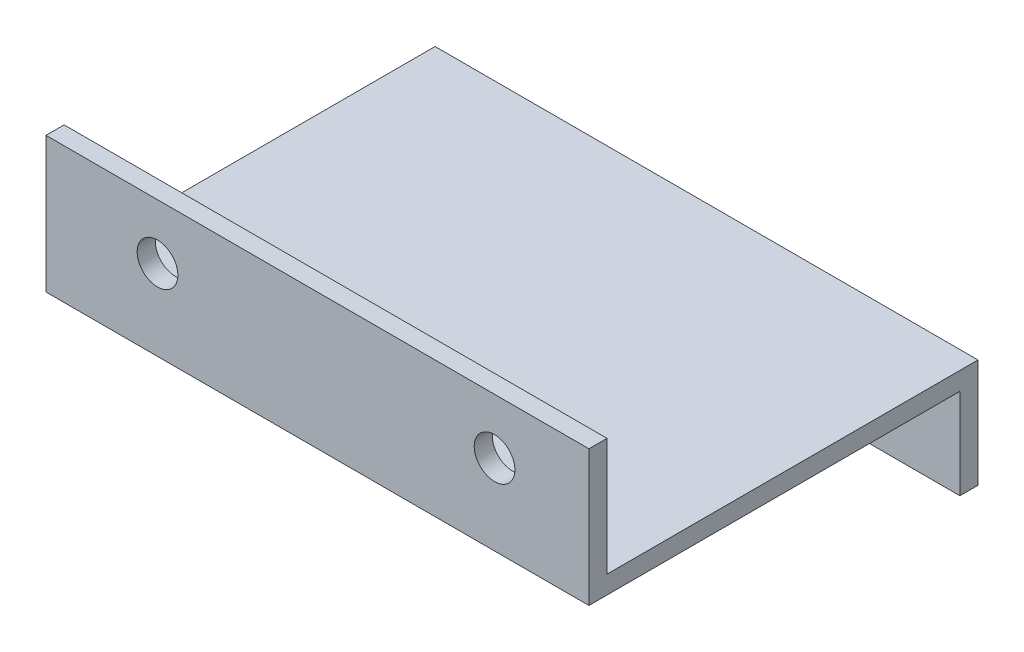
ISO-10303-21;
HEADER;
FILE_DESCRIPTION(('STEP AP214'),'2;1');
FILE_NAME('part.step','',(''),(''),'','','');
FILE_SCHEMA(('AUTOMOTIVE_DESIGN { 1 0 10303 214 1 1 1 1 }'));
ENDSEC;
DATA;
#1=APPLICATION_CONTEXT('core data for automotive mechanical design processes');
#2=APPLICATION_PROTOCOL_DEFINITION('international standard','automotive_design',2000,#1);
#3=PRODUCT_CONTEXT('',#1,'mechanical');
#4=PRODUCT('Part','Part','',(#3));
#5=PRODUCT_RELATED_PRODUCT_CATEGORY('part','',(#4));
#6=PRODUCT_DEFINITION_FORMATION('','',#4);
#7=PRODUCT_DEFINITION_CONTEXT('part definition',#1,'design');
#8=PRODUCT_DEFINITION('design','',#6,#7);
#9=PRODUCT_DEFINITION_SHAPE('','',#8);
#10=(LENGTH_UNIT() NAMED_UNIT(*) SI_UNIT(.MILLI.,.METRE.));
#11=(NAMED_UNIT(*) PLANE_ANGLE_UNIT() SI_UNIT($,.RADIAN.));
#12=(NAMED_UNIT(*) SI_UNIT($,.STERADIAN.) SOLID_ANGLE_UNIT());
#13=UNCERTAINTY_MEASURE_WITH_UNIT(LENGTH_MEASURE(1.E-05),#10,'distance_accuracy_value','');
#14=(GEOMETRIC_REPRESENTATION_CONTEXT(3) GLOBAL_UNCERTAINTY_ASSIGNED_CONTEXT((#13)) GLOBAL_UNIT_ASSIGNED_CONTEXT((#10,
#11,#12)) REPRESENTATION_CONTEXT('',''));
#15=CARTESIAN_POINT('',(0.,0.,0.));
#16=DIRECTION('',(0.,0.,1.));
#17=DIRECTION('',(1.,0.,0.));
#18=AXIS2_PLACEMENT_3D('',#15,#16,#17);
#19=CARTESIAN_POINT('',(-30.,-10.,43.));
#20=DIRECTION('',(0.,1.,0.));
#21=DIRECTION('',(0.,0.,1.));
#22=AXIS2_PLACEMENT_3D('',#19,#20,#21);
#23=PLANE('',#22);
#24=DIRECTION('',(1.,0.,0.));
#25=VECTOR('',#24,1.);
#26=CARTESIAN_POINT('',(30.,-10.,1.99999999999999));
#27=LINE('',#26,#25);
#28=CARTESIAN_POINT('',(-30.,-10.,1.99999999999999));
#29=VERTEX_POINT('',#28);
#30=CARTESIAN_POINT('',(30.,-10.,1.99999999999999));
#31=VERTEX_POINT('',#30);
#32=EDGE_CURVE('E140',#29,#31,#27,.T.);
#33=ORIENTED_EDGE('',*,*,#32,.F.);
#34=DIRECTION('',(0.,0.,-1.));
#35=VECTOR('',#34,1.);
#36=CARTESIAN_POINT('',(-30.,-10.,43.));
#37=LINE('',#36,#35);
#38=CARTESIAN_POINT('',(-30.,-10.,0.));
#39=VERTEX_POINT('',#38);
#40=EDGE_CURVE('E11',#29,#39,#37,.T.);
#41=ORIENTED_EDGE('',*,*,#40,.T.);
#42=DIRECTION('',(1.,0.,0.));
#43=VECTOR('',#42,1.);
#44=CARTESIAN_POINT('',(-30.,-10.,0.));
#45=LINE('',#44,#43);
#46=CARTESIAN_POINT('',(30.,-10.,0.));
#47=VERTEX_POINT('',#46);
#48=EDGE_CURVE('E158',#39,#47,#45,.T.);
#49=ORIENTED_EDGE('',*,*,#48,.T.);
#50=DIRECTION('',(0.,0.,-1.));
#51=VECTOR('',#50,1.);
#52=CARTESIAN_POINT('',(30.,-10.,43.));
#53=LINE('',#52,#51);
#54=EDGE_CURVE('E41',#31,#47,#53,.T.);
#55=ORIENTED_EDGE('',*,*,#54,.F.);
#56=EDGE_LOOP('',(#33,#41,#49,#55));
#57=FACE_BOUND('',#56,.T.);
#58=ADVANCED_FACE('F33',(#57),#23,.F.);
#59=CARTESIAN_POINT('',(30.,-10.,43.));
#60=DIRECTION('',(-1.,0.,0.));
#61=DIRECTION('',(0.,0.,1.));
#62=AXIS2_PLACEMENT_3D('',#59,#60,#61);
#63=PLANE('',#62);
#64=DIRECTION('',(0.,1.,0.));
#65=VECTOR('',#64,1.);
#66=CARTESIAN_POINT('',(30.,-10.,43.));
#67=LINE('',#66,#65);
#68=CARTESIAN_POINT('',(30.,0.,43.));
#69=VERTEX_POINT('',#68);
#70=CARTESIAN_POINT('',(30.,15.,43.));
#71=VERTEX_POINT('',#70);
#72=EDGE_CURVE('E155',#69,#71,#67,.T.);
#73=ORIENTED_EDGE('',*,*,#72,.F.);
#74=DIRECTION('',(0.,0.,1.));
#75=VECTOR('',#74,1.);
#76=CARTESIAN_POINT('',(30.,0.,1.99999999999999));
#77=LINE('',#76,#75);
#78=CARTESIAN_POINT('',(30.,0.,1.99999999999999));
#79=VERTEX_POINT('',#78);
#80=EDGE_CURVE('E48',#79,#69,#77,.T.);
#81=ORIENTED_EDGE('',*,*,#80,.F.);
#82=DIRECTION('',(0.,1.,0.));
#83=VECTOR('',#82,1.);
#84=CARTESIAN_POINT('',(30.,-10.,1.99999999999999));
#85=LINE('',#84,#83);
#86=EDGE_CURVE('E132',#31,#79,#85,.T.);
#87=ORIENTED_EDGE('',*,*,#86,.F.);
#88=ORIENTED_EDGE('',*,*,#54,.T.);
#89=DIRECTION('',(0.,1.,0.));
#90=VECTOR('',#89,1.);
#91=CARTESIAN_POINT('',(30.,-10.,0.));
#92=LINE('',#91,#90);
#93=CARTESIAN_POINT('',(30.,2.,0.));
#94=VERTEX_POINT('',#93);
#95=EDGE_CURVE('E153',#47,#94,#92,.T.);
#96=ORIENTED_EDGE('',*,*,#95,.T.);
#97=DIRECTION('',(0.,0.,-1.));
#98=VECTOR('',#97,1.);
#99=CARTESIAN_POINT('',(30.,2.,41.));
#100=LINE('',#99,#98);
#101=CARTESIAN_POINT('',(30.,2.,41.));
#102=VERTEX_POINT('',#101);
#103=EDGE_CURVE('E56',#102,#94,#100,.T.);
#104=ORIENTED_EDGE('',*,*,#103,.F.);
#105=DIRECTION('',(0.,-1.,0.));
#106=VECTOR('',#105,1.);
#107=CARTESIAN_POINT('',(30.,10.,41.));
#108=LINE('',#107,#106);
#109=CARTESIAN_POINT('',(30.,15.,41.));
#110=VERTEX_POINT('',#109);
#111=EDGE_CURVE('E97',#110,#102,#108,.T.);
#112=ORIENTED_EDGE('',*,*,#111,.F.);
#113=DIRECTION('',(0.,0.,-1.));
#114=VECTOR('',#113,1.);
#115=CARTESIAN_POINT('',(30.,15.,43.));
#116=LINE('',#115,#114);
#117=EDGE_CURVE('E101',#71,#110,#116,.T.);
#118=ORIENTED_EDGE('',*,*,#117,.F.);
#119=EDGE_LOOP('',(#73,#81,#87,#88,#96,#104,#112,#118));
#120=FACE_BOUND('',#119,.T.);
#121=ADVANCED_FACE('F35',(#120),#63,.F.);
#122=CARTESIAN_POINT('',(-30.,-10.,43.));
#123=DIRECTION('',(1.,0.,0.));
#124=DIRECTION('',(0.,0.,-1.));
#125=AXIS2_PLACEMENT_3D('',#122,#123,#124);
#126=PLANE('',#125);
#127=DIRECTION('',(0.,-1.,0.));
#128=VECTOR('',#127,1.);
#129=CARTESIAN_POINT('',(-30.,-10.,1.99999999999999));
#130=LINE('',#129,#128);
#131=CARTESIAN_POINT('',(-30.,0.,1.99999999999999));
#132=VERTEX_POINT('',#131);
#133=EDGE_CURVE('E138',#132,#29,#130,.T.);
#134=ORIENTED_EDGE('',*,*,#133,.F.);
#135=DIRECTION('',(0.,0.,1.));
#136=VECTOR('',#135,1.);
#137=CARTESIAN_POINT('',(-30.,0.,1.99999999999999));
#138=LINE('',#137,#136);
#139=CARTESIAN_POINT('',(-30.,0.,43.));
#140=VERTEX_POINT('',#139);
#141=EDGE_CURVE('E143',#132,#140,#138,.T.);
#142=ORIENTED_EDGE('',*,*,#141,.T.);
#143=DIRECTION('',(0.,-1.,0.));
#144=VECTOR('',#143,1.);
#145=CARTESIAN_POINT('',(-30.,-10.,43.));
#146=LINE('',#145,#144);
#147=CARTESIAN_POINT('',(-30.,15.,43.));
#148=VERTEX_POINT('',#147);
#149=EDGE_CURVE('E157',#148,#140,#146,.T.);
#150=ORIENTED_EDGE('',*,*,#149,.F.);
#151=DIRECTION('',(0.,0.,1.));
#152=VECTOR('',#151,1.);
#153=CARTESIAN_POINT('',(-30.,15.,41.));
#154=LINE('',#153,#152);
#155=CARTESIAN_POINT('',(-30.,15.,41.));
#156=VERTEX_POINT('',#155);
#157=EDGE_CURVE('E116',#156,#148,#154,.T.);
#158=ORIENTED_EDGE('',*,*,#157,.F.);
#159=DIRECTION('',(0.,1.,0.));
#160=VECTOR('',#159,1.);
#161=CARTESIAN_POINT('',(-30.,10.,41.));
#162=LINE('',#161,#160);
#163=CARTESIAN_POINT('',(-30.,2.,41.));
#164=VERTEX_POINT('',#163);
#165=EDGE_CURVE('E112',#164,#156,#162,.T.);
#166=ORIENTED_EDGE('',*,*,#165,.F.);
#167=DIRECTION('',(0.,0.,-1.));
#168=VECTOR('',#167,1.);
#169=CARTESIAN_POINT('',(-30.,2.,41.));
#170=LINE('',#169,#168);
#171=CARTESIAN_POINT('',(-30.,2.,0.));
#172=VERTEX_POINT('',#171);
#173=EDGE_CURVE('E150',#164,#172,#170,.T.);
#174=ORIENTED_EDGE('',*,*,#173,.T.);
#175=DIRECTION('',(0.,-1.,0.));
#176=VECTOR('',#175,1.);
#177=CARTESIAN_POINT('',(-30.,-10.,0.));
#178=LINE('',#177,#176);
#179=EDGE_CURVE('E162',#172,#39,#178,.T.);
#180=ORIENTED_EDGE('',*,*,#179,.T.);
#181=ORIENTED_EDGE('',*,*,#40,.F.);
#182=EDGE_LOOP('',(#134,#142,#150,#158,#166,#174,#180,#181));
#183=FACE_BOUND('',#182,.T.);
#184=ADVANCED_FACE('F179',(#183),#126,.F.);
#185=CARTESIAN_POINT('',(0.,0.,43.));
#186=DIRECTION('',(0.,0.,-1.));
#187=DIRECTION('',(-1.,0.,0.));
#188=AXIS2_PLACEMENT_3D('',#185,#186,#187);
#189=PLANE('',#188);
#190=CARTESIAN_POINT('',(19.5711604288178,8.89368921249556,43.));
#191=DIRECTION('',(0.,0.,-1.));
#192=DIRECTION('',(-1.,0.,0.));
#193=AXIS2_PLACEMENT_3D('',#190,#191,#192);
#194=CIRCLE('',#193,2.25);
#195=CARTESIAN_POINT('',(17.3211604288178,8.89368921249556,43.));
#196=VERTEX_POINT('',#195);
#197=EDGE_CURVE('E227',#196,#196,#194,.T.);
#198=ORIENTED_EDGE('',*,*,#197,.T.);
#199=EDGE_LOOP('',(#198));
#200=FACE_BOUND('',#199,.T.);
#201=CARTESIAN_POINT('',(-17.6761757128006,8.89368921249556,43.));
#202=DIRECTION('',(0.,0.,-1.));
#203=DIRECTION('',(-1.,0.,0.));
#204=AXIS2_PLACEMENT_3D('',#201,#202,#203);
#205=CIRCLE('',#204,2.25);
#206=CARTESIAN_POINT('',(-19.9261757128006,8.89368921249556,43.));
#207=VERTEX_POINT('',#206);
#208=EDGE_CURVE('E122',#207,#207,#205,.T.);
#209=ORIENTED_EDGE('',*,*,#208,.T.);
#210=EDGE_LOOP('',(#209));
#211=FACE_BOUND('',#210,.T.);
#212=ORIENTED_EDGE('',*,*,#149,.T.);
#213=DIRECTION('',(-1.,0.,0.));
#214=VECTOR('',#213,1.);
#215=CARTESIAN_POINT('',(30.,0.,43.));
#216=LINE('',#215,#214);
#217=EDGE_CURVE('E131',#69,#140,#216,.T.);
#218=ORIENTED_EDGE('',*,*,#217,.F.);
#219=ORIENTED_EDGE('',*,*,#72,.T.);
#220=DIRECTION('',(1.,0.,0.));
#221=VECTOR('',#220,1.);
#222=CARTESIAN_POINT('',(-30.,15.,43.));
#223=LINE('',#222,#221);
#224=EDGE_CURVE('E121',#148,#71,#223,.T.);
#225=ORIENTED_EDGE('',*,*,#224,.F.);
#226=EDGE_LOOP('',(#212,#218,#219,#225));
#227=FACE_BOUND('',#226,.T.);
#228=ADVANCED_FACE('F181',(#200,#211,#227),#189,.F.);
#229=CARTESIAN_POINT('',(0.,0.,0.));
#230=DIRECTION('',(0.,0.,-1.));
#231=DIRECTION('',(-1.,0.,0.));
#232=AXIS2_PLACEMENT_3D('',#229,#230,#231);
#233=PLANE('',#232);
#234=DIRECTION('',(-1.,0.,0.));
#235=VECTOR('',#234,1.);
#236=CARTESIAN_POINT('',(30.,2.,0.));
#237=LINE('',#236,#235);
#238=EDGE_CURVE('E106',#94,#172,#237,.T.);
#239=ORIENTED_EDGE('',*,*,#238,.F.);
#240=ORIENTED_EDGE('',*,*,#95,.F.);
#241=ORIENTED_EDGE('',*,*,#48,.F.);
#242=ORIENTED_EDGE('',*,*,#179,.F.);
#243=EDGE_LOOP('',(#239,#240,#241,#242));
#244=FACE_BOUND('',#243,.T.);
#245=ADVANCED_FACE('F175',(#244),#233,.T.);
#246=CARTESIAN_POINT('',(30.,2.,41.));
#247=DIRECTION('',(0.,-1.,0.));
#248=DIRECTION('',(0.,0.,-1.));
#249=AXIS2_PLACEMENT_3D('',#246,#247,#248);
#250=PLANE('',#249);
#251=ORIENTED_EDGE('',*,*,#238,.T.);
#252=ORIENTED_EDGE('',*,*,#173,.F.);
#253=DIRECTION('',(-1.,0.,0.));
#254=VECTOR('',#253,1.);
#255=CARTESIAN_POINT('',(30.,2.,41.));
#256=LINE('',#255,#254);
#257=EDGE_CURVE('E105',#102,#164,#256,.T.);
#258=ORIENTED_EDGE('',*,*,#257,.F.);
#259=ORIENTED_EDGE('',*,*,#103,.T.);
#260=EDGE_LOOP('',(#251,#252,#258,#259));
#261=FACE_BOUND('',#260,.T.);
#262=ADVANCED_FACE('F176',(#261),#250,.F.);
#263=CARTESIAN_POINT('',(0.,0.,41.));
#264=DIRECTION('',(0.,0.,-1.));
#265=DIRECTION('',(-1.,0.,0.));
#266=AXIS2_PLACEMENT_3D('',#263,#264,#265);
#267=PLANE('',#266);
#268=CARTESIAN_POINT('',(19.5711604288178,8.89368921249556,41.));
#269=DIRECTION('',(0.,0.,-1.));
#270=DIRECTION('',(-1.,0.,0.));
#271=AXIS2_PLACEMENT_3D('',#268,#269,#270);
#272=CIRCLE('',#271,2.25);
#273=CARTESIAN_POINT('',(17.3211604288178,8.89368921249556,41.));
#274=VERTEX_POINT('',#273);
#275=EDGE_CURVE('E223',#274,#274,#272,.T.);
#276=ORIENTED_EDGE('',*,*,#275,.F.);
#277=EDGE_LOOP('',(#276));
#278=FACE_BOUND('',#277,.T.);
#279=CARTESIAN_POINT('',(-17.6761757128006,8.89368921249556,41.));
#280=DIRECTION('',(0.,0.,-1.));
#281=DIRECTION('',(-1.,0.,0.));
#282=AXIS2_PLACEMENT_3D('',#279,#280,#281);
#283=CIRCLE('',#282,2.25);
#284=CARTESIAN_POINT('',(-19.9261757128006,8.89368921249556,41.));
#285=VERTEX_POINT('',#284);
#286=EDGE_CURVE('E125',#285,#285,#283,.T.);
#287=ORIENTED_EDGE('',*,*,#286,.F.);
#288=EDGE_LOOP('',(#287));
#289=FACE_BOUND('',#288,.T.);
#290=ORIENTED_EDGE('',*,*,#111,.T.);
#291=ORIENTED_EDGE('',*,*,#257,.T.);
#292=ORIENTED_EDGE('',*,*,#165,.T.);
#293=DIRECTION('',(-1.,0.,0.));
#294=VECTOR('',#293,1.);
#295=CARTESIAN_POINT('',(30.,15.,41.));
#296=LINE('',#295,#294);
#297=EDGE_CURVE('E109',#110,#156,#296,.T.);
#298=ORIENTED_EDGE('',*,*,#297,.F.);
#299=EDGE_LOOP('',(#290,#291,#292,#298));
#300=FACE_BOUND('',#299,.T.);
#301=ADVANCED_FACE('F110',(#278,#289,#300),#267,.T.);
#302=CARTESIAN_POINT('',(30.,0.,1.99999999999999));
#303=DIRECTION('',(0.,1.,0.));
#304=DIRECTION('',(-1.,0.,0.));
#305=AXIS2_PLACEMENT_3D('',#302,#303,#304);
#306=PLANE('',#305);
#307=ORIENTED_EDGE('',*,*,#217,.T.);
#308=ORIENTED_EDGE('',*,*,#141,.F.);
#309=DIRECTION('',(-1.,0.,0.));
#310=VECTOR('',#309,1.);
#311=CARTESIAN_POINT('',(30.,0.,1.99999999999999));
#312=LINE('',#311,#310);
#313=EDGE_CURVE('E135',#79,#132,#312,.T.);
#314=ORIENTED_EDGE('',*,*,#313,.F.);
#315=ORIENTED_EDGE('',*,*,#80,.T.);
#316=EDGE_LOOP('',(#307,#308,#314,#315));
#317=FACE_BOUND('',#316,.T.);
#318=ADVANCED_FACE('F182',(#317),#306,.F.);
#319=CARTESIAN_POINT('',(0.,0.,1.99999999999999));
#320=DIRECTION('',(0.,0.,1.));
#321=DIRECTION('',(1.,0.,0.));
#322=AXIS2_PLACEMENT_3D('',#319,#320,#321);
#323=PLANE('',#322);
#324=ORIENTED_EDGE('',*,*,#86,.T.);
#325=ORIENTED_EDGE('',*,*,#313,.T.);
#326=ORIENTED_EDGE('',*,*,#133,.T.);
#327=ORIENTED_EDGE('',*,*,#32,.T.);
#328=EDGE_LOOP('',(#324,#325,#326,#327));
#329=FACE_BOUND('',#328,.T.);
#330=ADVANCED_FACE('F184',(#329),#323,.T.);
#331=CARTESIAN_POINT('',(0.,15.,0.));
#332=DIRECTION('',(0.,1.,0.));
#333=DIRECTION('',(0.,0.,1.));
#334=AXIS2_PLACEMENT_3D('',#331,#332,#333);
#335=PLANE('',#334);
#336=ORIENTED_EDGE('',*,*,#117,.T.);
#337=ORIENTED_EDGE('',*,*,#297,.T.);
#338=ORIENTED_EDGE('',*,*,#157,.T.);
#339=ORIENTED_EDGE('',*,*,#224,.T.);
#340=EDGE_LOOP('',(#336,#337,#338,#339));
#341=FACE_BOUND('',#340,.T.);
#342=ADVANCED_FACE('F119',(#341),#335,.T.);
#343=CARTESIAN_POINT('',(-17.6761757128006,8.89368921249556,41.));
#344=DIRECTION('',(0.,0.,-1.));
#345=DIRECTION('',(-1.,0.,0.));
#346=AXIS2_PLACEMENT_3D('',#343,#344,#345);
#347=CYLINDRICAL_SURFACE('',#346,2.25);
#348=ORIENTED_EDGE('',*,*,#208,.F.);
#349=EDGE_LOOP('',(#348));
#350=FACE_BOUND('',#349,.T.);
#351=ORIENTED_EDGE('',*,*,#286,.T.);
#352=EDGE_LOOP('',(#351));
#353=FACE_BOUND('',#352,.T.);
#354=ADVANCED_FACE('F192',(#350,#353),#347,.F.);
#355=CARTESIAN_POINT('',(19.5711604288178,8.89368921249556,41.));
#356=DIRECTION('',(0.,0.,-1.));
#357=DIRECTION('',(-1.,0.,0.));
#358=AXIS2_PLACEMENT_3D('',#355,#356,#357);
#359=CYLINDRICAL_SURFACE('',#358,2.25);
#360=ORIENTED_EDGE('',*,*,#197,.F.);
#361=EDGE_LOOP('',(#360));
#362=FACE_BOUND('',#361,.T.);
#363=ORIENTED_EDGE('',*,*,#275,.T.);
#364=EDGE_LOOP('',(#363));
#365=FACE_BOUND('',#364,.T.);
#366=ADVANCED_FACE('F231',(#362,#365),#359,.F.);
#367=CLOSED_SHELL('',(#58,#121,#184,#228,#245,#262,#301,#318,#330,#342,#354,#366));
#368=MANIFOLD_SOLID_BREP('B2',#367);
#369=ADVANCED_BREP_SHAPE_REPRESENTATION('',(#18,#368),#14);
#370=SHAPE_DEFINITION_REPRESENTATION(#9,#369);
ENDSEC;
END-ISO-10303-21;
